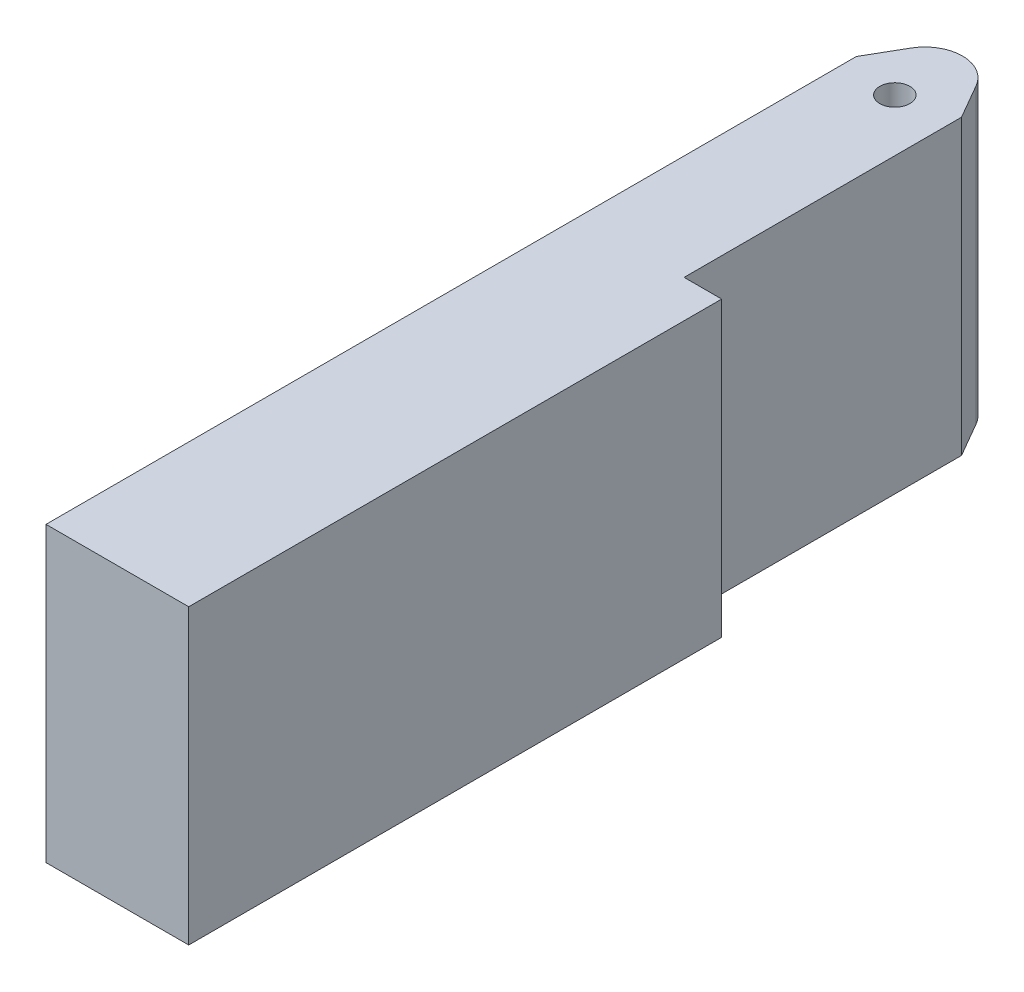
ISO-10303-21;
HEADER;
FILE_DESCRIPTION(('STEP AP214'),'2;1');
FILE_NAME('part.step','',(''),(''),'','','');
FILE_SCHEMA(('AUTOMOTIVE_DESIGN { 1 0 10303 214 1 1 1 1 }'));
ENDSEC;
DATA;
#1=APPLICATION_CONTEXT('core data for automotive mechanical design processes');
#2=APPLICATION_PROTOCOL_DEFINITION('international standard','automotive_design',2000,#1);
#3=PRODUCT_CONTEXT('',#1,'mechanical');
#4=PRODUCT('Part','Part','',(#3));
#5=PRODUCT_RELATED_PRODUCT_CATEGORY('part','',(#4));
#6=PRODUCT_DEFINITION_FORMATION('','',#4);
#7=PRODUCT_DEFINITION_CONTEXT('part definition',#1,'design');
#8=PRODUCT_DEFINITION('design','',#6,#7);
#9=PRODUCT_DEFINITION_SHAPE('','',#8);
#10=(LENGTH_UNIT() NAMED_UNIT(*) SI_UNIT(.MILLI.,.METRE.));
#11=(NAMED_UNIT(*) PLANE_ANGLE_UNIT() SI_UNIT($,.RADIAN.));
#12=(NAMED_UNIT(*) SI_UNIT($,.STERADIAN.) SOLID_ANGLE_UNIT());
#13=UNCERTAINTY_MEASURE_WITH_UNIT(LENGTH_MEASURE(1.E-05),#10,'distance_accuracy_value','');
#14=(GEOMETRIC_REPRESENTATION_CONTEXT(3) GLOBAL_UNCERTAINTY_ASSIGNED_CONTEXT((#13)) GLOBAL_UNIT_ASSIGNED_CONTEXT((#10,
#11,#12)) REPRESENTATION_CONTEXT('',''));
#15=CARTESIAN_POINT('',(0.,0.,0.));
#16=DIRECTION('',(0.,0.,1.));
#17=DIRECTION('',(1.,0.,0.));
#18=AXIS2_PLACEMENT_3D('',#15,#16,#17);
#19=CARTESIAN_POINT('',(0.,0.,-49.9999999999999));
#20=DIRECTION('',(0.,-1.,0.));
#21=DIRECTION('',(0.,0.,-1.));
#22=AXIS2_PLACEMENT_3D('',#19,#20,#21);
#23=CYLINDRICAL_SURFACE('',#22,5.);
#24=DIRECTION('',(0.,-1.,0.));
#25=VECTOR('',#24,1.);
#26=CARTESIAN_POINT('',(-4.33012701892221,0.,-52.4999999999999));
#27=LINE('',#26,#25);
#28=CARTESIAN_POINT('',(-4.33012701892221,39.,-52.4999999999999));
#29=VERTEX_POINT('',#28);
#30=CARTESIAN_POINT('',(-4.33012701892221,0.,-52.4999999999999));
#31=VERTEX_POINT('',#30);
#32=EDGE_CURVE('E156',#29,#31,#27,.T.);
#33=ORIENTED_EDGE('',*,*,#32,.F.);
#34=CARTESIAN_POINT('',(0.,39.,-49.9999999999999));
#35=DIRECTION('',(0.,1.,0.));
#36=DIRECTION('',(0.,0.,1.));
#37=AXIS2_PLACEMENT_3D('',#34,#35,#36);
#38=CIRCLE('',#37,5.);
#39=CARTESIAN_POINT('',(4.3301270189222,39.,-52.4999999999999));
#40=VERTEX_POINT('',#39);
#41=EDGE_CURVE('E41',#40,#29,#38,.T.);
#42=ORIENTED_EDGE('',*,*,#41,.F.);
#43=DIRECTION('',(0.,-1.,0.));
#44=VECTOR('',#43,1.);
#45=CARTESIAN_POINT('',(4.3301270189222,0.,-52.4999999999999));
#46=LINE('',#45,#44);
#47=CARTESIAN_POINT('',(4.3301270189222,0.,-52.4999999999999));
#48=VERTEX_POINT('',#47);
#49=EDGE_CURVE('E161',#48,#40,#46,.F.);
#50=ORIENTED_EDGE('',*,*,#49,.F.);
#51=CARTESIAN_POINT('',(0.,0.,-49.9999999999999));
#52=DIRECTION('',(0.,1.,0.));
#53=DIRECTION('',(0.,0.,1.));
#54=AXIS2_PLACEMENT_3D('',#51,#52,#53);
#55=CIRCLE('',#54,5.);
#56=EDGE_CURVE('E12',#31,#48,#55,.F.);
#57=ORIENTED_EDGE('',*,*,#56,.F.);
#58=EDGE_LOOP('',(#33,#42,#50,#57));
#59=FACE_BOUND('',#58,.T.);
#60=ADVANCED_FACE('F34',(#59),#23,.T.);
#61=CARTESIAN_POINT('',(0.,39.,0.));
#62=DIRECTION('',(0.,1.,0.));
#63=DIRECTION('',(0.,0.,1.));
#64=AXIS2_PLACEMENT_3D('',#61,#62,#63);
#65=PLANE('',#64);
#66=DIRECTION('',(1.,0.,0.));
#67=VECTOR('',#66,1.);
#68=CARTESIAN_POINT('',(7.,39.,-10.9474411167422));
#69=LINE('',#68,#67);
#70=CARTESIAN_POINT('',(7.,39.,-10.9474411167422));
#71=VERTEX_POINT('',#70);
#72=CARTESIAN_POINT('',(12.,39.,-10.9474411167422));
#73=VERTEX_POINT('',#72);
#74=EDGE_CURVE('E48',#71,#73,#69,.T.);
#75=ORIENTED_EDGE('',*,*,#74,.F.);
#76=DIRECTION('',(0.,0.,1.));
#77=VECTOR('',#76,1.);
#78=CARTESIAN_POINT('',(7.,39.,-36.9474411167422));
#79=LINE('',#78,#77);
#80=CARTESIAN_POINT('',(7.,39.,-47.8756443470177));
#81=VERTEX_POINT('',#80);
#82=EDGE_CURVE('E105',#81,#71,#79,.T.);
#83=ORIENTED_EDGE('',*,*,#82,.F.);
#84=DIRECTION('',(-0.499999999999997,0.,-0.866025403784441));
#85=VECTOR('',#84,1.);
#86=CARTESIAN_POINT('',(11.,39.,-40.9474411167422));
#87=LINE('',#86,#85);
#88=EDGE_CURVE('E143',#81,#40,#87,.T.);
#89=ORIENTED_EDGE('',*,*,#88,.T.);
#90=ORIENTED_EDGE('',*,*,#41,.T.);
#91=DIRECTION('',(-0.499999999999996,0.,0.866025403784441));
#92=VECTOR('',#91,1.);
#93=CARTESIAN_POINT('',(0.,39.,-60.));
#94=LINE('',#93,#92);
#95=CARTESIAN_POINT('',(-6.99999999999996,39.,-47.8756443470178));
#96=VERTEX_POINT('',#95);
#97=EDGE_CURVE('E146',#29,#96,#94,.T.);
#98=ORIENTED_EDGE('',*,*,#97,.T.);
#99=DIRECTION('',(0.,0.,-1.));
#100=VECTOR('',#99,1.);
#101=CARTESIAN_POINT('',(-7.00000000000001,39.,-36.9474411167422));
#102=LINE('',#101,#100);
#103=CARTESIAN_POINT('',(-7.00000000000001,39.,60.));
#104=VERTEX_POINT('',#103);
#105=EDGE_CURVE('E135',#104,#96,#102,.T.);
#106=ORIENTED_EDGE('',*,*,#105,.F.);
#107=DIRECTION('',(1.,0.,0.));
#108=VECTOR('',#107,1.);
#109=CARTESIAN_POINT('',(-11.,39.,60.));
#110=LINE('',#109,#108);
#111=CARTESIAN_POINT('',(12.,39.,60.));
#112=VERTEX_POINT('',#111);
#113=EDGE_CURVE('E153',#104,#112,#110,.T.);
#114=ORIENTED_EDGE('',*,*,#113,.T.);
#115=DIRECTION('',(0.,0.,1.));
#116=VECTOR('',#115,1.);
#117=CARTESIAN_POINT('',(12.,39.,60.));
#118=LINE('',#117,#116);
#119=EDGE_CURVE('E121',#73,#112,#118,.T.);
#120=ORIENTED_EDGE('',*,*,#119,.F.);
#121=EDGE_LOOP('',(#75,#83,#89,#90,#98,#106,#114,#120));
#122=FACE_BOUND('',#121,.T.);
#123=CARTESIAN_POINT('',(0.,39.,-45.9999999999999));
#124=DIRECTION('',(0.,1.,0.));
#125=DIRECTION('',(0.,0.,1.));
#126=AXIS2_PLACEMENT_3D('',#123,#124,#125);
#127=CIRCLE('',#126,2.);
#128=CARTESIAN_POINT('',(0.,39.,-43.9999999999999));
#129=VERTEX_POINT('',#128);
#130=EDGE_CURVE('E116',#129,#129,#127,.T.);
#131=ORIENTED_EDGE('',*,*,#130,.F.);
#132=EDGE_LOOP('',(#131));
#133=FACE_BOUND('',#132,.T.);
#134=ADVANCED_FACE('F166',(#122,#133),#65,.T.);
#135=CARTESIAN_POINT('',(0.,0.,0.));
#136=DIRECTION('',(0.,1.,0.));
#137=DIRECTION('',(0.,0.,1.));
#138=AXIS2_PLACEMENT_3D('',#135,#136,#137);
#139=PLANE('',#138);
#140=CARTESIAN_POINT('',(0.,0.,-45.9999999999999));
#141=DIRECTION('',(0.,1.,0.));
#142=DIRECTION('',(0.,0.,1.));
#143=AXIS2_PLACEMENT_3D('',#140,#141,#142);
#144=CIRCLE('',#143,2.);
#145=CARTESIAN_POINT('',(0.,0.,-43.9999999999999));
#146=VERTEX_POINT('',#145);
#147=EDGE_CURVE('E118',#146,#146,#144,.T.);
#148=ORIENTED_EDGE('',*,*,#147,.T.);
#149=EDGE_LOOP('',(#148));
#150=FACE_BOUND('',#149,.T.);
#151=DIRECTION('',(0.,0.,1.));
#152=VECTOR('',#151,1.);
#153=CARTESIAN_POINT('',(7.,0.,-36.9474411167422));
#154=LINE('',#153,#152);
#155=CARTESIAN_POINT('',(7.00000000000004,0.,-47.8756443470177));
#156=VERTEX_POINT('',#155);
#157=CARTESIAN_POINT('',(7.,0.,-10.9474411167422));
#158=VERTEX_POINT('',#157);
#159=EDGE_CURVE('E56',#156,#158,#154,.T.);
#160=ORIENTED_EDGE('',*,*,#159,.T.);
#161=DIRECTION('',(1.,0.,0.));
#162=VECTOR('',#161,1.);
#163=CARTESIAN_POINT('',(7.,0.,-10.9474411167422));
#164=LINE('',#163,#162);
#165=CARTESIAN_POINT('',(12.,0.,-10.9474411167422));
#166=VERTEX_POINT('',#165);
#167=EDGE_CURVE('E101',#158,#166,#164,.T.);
#168=ORIENTED_EDGE('',*,*,#167,.T.);
#169=DIRECTION('',(0.,0.,1.));
#170=VECTOR('',#169,1.);
#171=CARTESIAN_POINT('',(12.,0.,60.));
#172=LINE('',#171,#170);
#173=CARTESIAN_POINT('',(12.,0.,60.));
#174=VERTEX_POINT('',#173);
#175=EDGE_CURVE('E124',#166,#174,#172,.T.);
#176=ORIENTED_EDGE('',*,*,#175,.T.);
#177=DIRECTION('',(1.,0.,0.));
#178=VECTOR('',#177,1.);
#179=CARTESIAN_POINT('',(-11.,0.,60.));
#180=LINE('',#179,#178);
#181=CARTESIAN_POINT('',(-7.00000000000001,0.,60.));
#182=VERTEX_POINT('',#181);
#183=EDGE_CURVE('E149',#182,#174,#180,.T.);
#184=ORIENTED_EDGE('',*,*,#183,.F.);
#185=DIRECTION('',(0.,0.,-1.));
#186=VECTOR('',#185,1.);
#187=CARTESIAN_POINT('',(-7.00000000000001,0.,-36.9474411167422));
#188=LINE('',#187,#186);
#189=CARTESIAN_POINT('',(-7.00000000000001,0.,-47.8756443470178));
#190=VERTEX_POINT('',#189);
#191=EDGE_CURVE('E136',#182,#190,#188,.T.);
#192=ORIENTED_EDGE('',*,*,#191,.T.);
#193=DIRECTION('',(-0.499999999999996,0.,0.866025403784441));
#194=VECTOR('',#193,1.);
#195=CARTESIAN_POINT('',(0.,0.,-60.));
#196=LINE('',#195,#194);
#197=EDGE_CURVE('E145',#31,#190,#196,.T.);
#198=ORIENTED_EDGE('',*,*,#197,.F.);
#199=ORIENTED_EDGE('',*,*,#56,.T.);
#200=DIRECTION('',(-0.499999999999997,0.,-0.866025403784441));
#201=VECTOR('',#200,1.);
#202=CARTESIAN_POINT('',(11.,0.,-40.9474411167422));
#203=LINE('',#202,#201);
#204=EDGE_CURVE('E103',#156,#48,#203,.T.);
#205=ORIENTED_EDGE('',*,*,#204,.F.);
#206=EDGE_LOOP('',(#160,#168,#176,#184,#192,#198,#199,#205));
#207=FACE_BOUND('',#206,.T.);
#208=ADVANCED_FACE('F99',(#150,#207),#139,.F.);
#209=CARTESIAN_POINT('',(-11.,39.,60.));
#210=DIRECTION('',(0.,0.,-1.));
#211=DIRECTION('',(-1.,0.,0.));
#212=AXIS2_PLACEMENT_3D('',#209,#210,#211);
#213=PLANE('',#212);
#214=ORIENTED_EDGE('',*,*,#183,.T.);
#215=DIRECTION('',(0.,1.,0.));
#216=VECTOR('',#215,1.);
#217=CARTESIAN_POINT('',(12.,0.,60.));
#218=LINE('',#217,#216);
#219=EDGE_CURVE('E126',#174,#112,#218,.T.);
#220=ORIENTED_EDGE('',*,*,#219,.T.);
#221=ORIENTED_EDGE('',*,*,#113,.F.);
#222=DIRECTION('',(0.,1.,0.));
#223=VECTOR('',#222,1.);
#224=CARTESIAN_POINT('',(-7.00000000000001,0.,60.));
#225=LINE('',#224,#223);
#226=EDGE_CURVE('E130',#182,#104,#225,.T.);
#227=ORIENTED_EDGE('',*,*,#226,.F.);
#228=EDGE_LOOP('',(#214,#220,#221,#227));
#229=FACE_BOUND('',#228,.T.);
#230=ADVANCED_FACE('F181',(#229),#213,.F.);
#231=CARTESIAN_POINT('',(11.,0.,-40.9474411167422));
#232=DIRECTION('',(0.866025403784441,0.,-0.499999999999997));
#233=DIRECTION('',(-0.499999999999997,0.,-0.866025403784441));
#234=AXIS2_PLACEMENT_3D('',#231,#232,#233);
#235=PLANE('',#234);
#236=DIRECTION('',(0.,1.,0.));
#237=VECTOR('',#236,1.);
#238=CARTESIAN_POINT('',(7.,0.,-47.8756443470177));
#239=LINE('',#238,#237);
#240=EDGE_CURVE('E104',#156,#81,#239,.T.);
#241=ORIENTED_EDGE('',*,*,#240,.F.);
#242=ORIENTED_EDGE('',*,*,#204,.T.);
#243=ORIENTED_EDGE('',*,*,#49,.T.);
#244=ORIENTED_EDGE('',*,*,#88,.F.);
#245=EDGE_LOOP('',(#241,#242,#243,#244));
#246=FACE_BOUND('',#245,.T.);
#247=ADVANCED_FACE('F210',(#246),#235,.T.);
#248=CARTESIAN_POINT('',(0.,0.,-60.));
#249=DIRECTION('',(-0.866025403784441,0.,-0.499999999999996));
#250=DIRECTION('',(-0.499999999999996,0.,0.866025403784441));
#251=AXIS2_PLACEMENT_3D('',#248,#249,#250);
#252=PLANE('',#251);
#253=DIRECTION('',(0.,1.,0.));
#254=VECTOR('',#253,1.);
#255=CARTESIAN_POINT('',(-7.00000000000001,0.,-47.8756443470178));
#256=LINE('',#255,#254);
#257=EDGE_CURVE('E139',#190,#96,#256,.T.);
#258=ORIENTED_EDGE('',*,*,#257,.T.);
#259=ORIENTED_EDGE('',*,*,#97,.F.);
#260=ORIENTED_EDGE('',*,*,#32,.T.);
#261=ORIENTED_EDGE('',*,*,#197,.T.);
#262=EDGE_LOOP('',(#258,#259,#260,#261));
#263=FACE_BOUND('',#262,.T.);
#264=ADVANCED_FACE('F174',(#263),#252,.T.);
#265=CARTESIAN_POINT('',(-7.00000000000001,0.,-36.9474411167422));
#266=DIRECTION('',(1.,0.,0.));
#267=DIRECTION('',(0.,0.,-1.));
#268=AXIS2_PLACEMENT_3D('',#265,#266,#267);
#269=PLANE('',#268);
#270=ORIENTED_EDGE('',*,*,#105,.T.);
#271=ORIENTED_EDGE('',*,*,#257,.F.);
#272=ORIENTED_EDGE('',*,*,#191,.F.);
#273=ORIENTED_EDGE('',*,*,#226,.T.);
#274=EDGE_LOOP('',(#270,#271,#272,#273));
#275=FACE_BOUND('',#274,.T.);
#276=ADVANCED_FACE('F176',(#275),#269,.F.);
#277=CARTESIAN_POINT('',(7.,0.,-36.9474411167422));
#278=DIRECTION('',(-1.,0.,0.));
#279=DIRECTION('',(0.,0.,1.));
#280=AXIS2_PLACEMENT_3D('',#277,#278,#279);
#281=PLANE('',#280);
#282=ORIENTED_EDGE('',*,*,#82,.T.);
#283=DIRECTION('',(0.,1.,0.));
#284=VECTOR('',#283,1.);
#285=CARTESIAN_POINT('',(7.,0.,-10.9474411167422));
#286=LINE('',#285,#284);
#287=EDGE_CURVE('E107',#158,#71,#286,.T.);
#288=ORIENTED_EDGE('',*,*,#287,.F.);
#289=ORIENTED_EDGE('',*,*,#159,.F.);
#290=ORIENTED_EDGE('',*,*,#240,.T.);
#291=EDGE_LOOP('',(#282,#288,#289,#290));
#292=FACE_BOUND('',#291,.T.);
#293=ADVANCED_FACE('F108',(#292),#281,.F.);
#294=CARTESIAN_POINT('',(12.,0.,60.));
#295=DIRECTION('',(-1.,0.,0.));
#296=DIRECTION('',(0.,0.,1.));
#297=AXIS2_PLACEMENT_3D('',#294,#295,#296);
#298=PLANE('',#297);
#299=ORIENTED_EDGE('',*,*,#175,.F.);
#300=DIRECTION('',(0.,1.,0.));
#301=VECTOR('',#300,1.);
#302=CARTESIAN_POINT('',(12.,0.,-10.9474411167422));
#303=LINE('',#302,#301);
#304=EDGE_CURVE('E110',#166,#73,#303,.T.);
#305=ORIENTED_EDGE('',*,*,#304,.T.);
#306=ORIENTED_EDGE('',*,*,#119,.T.);
#307=ORIENTED_EDGE('',*,*,#219,.F.);
#308=EDGE_LOOP('',(#299,#305,#306,#307));
#309=FACE_BOUND('',#308,.T.);
#310=ADVANCED_FACE('F185',(#309),#298,.F.);
#311=CARTESIAN_POINT('',(0.,0.,-45.9999999999999));
#312=DIRECTION('',(0.,1.,0.));
#313=DIRECTION('',(0.,0.,1.));
#314=AXIS2_PLACEMENT_3D('',#311,#312,#313);
#315=CYLINDRICAL_SURFACE('',#314,2.);
#316=ORIENTED_EDGE('',*,*,#147,.F.);
#317=EDGE_LOOP('',(#316));
#318=FACE_BOUND('',#317,.T.);
#319=ORIENTED_EDGE('',*,*,#130,.T.);
#320=EDGE_LOOP('',(#319));
#321=FACE_BOUND('',#320,.T.);
#322=ADVANCED_FACE('F187',(#318,#321),#315,.F.);
#323=CARTESIAN_POINT('',(7.,0.,-10.9474411167422));
#324=DIRECTION('',(0.,0.,1.));
#325=DIRECTION('',(1.,0.,0.));
#326=AXIS2_PLACEMENT_3D('',#323,#324,#325);
#327=PLANE('',#326);
#328=ORIENTED_EDGE('',*,*,#74,.T.);
#329=ORIENTED_EDGE('',*,*,#304,.F.);
#330=ORIENTED_EDGE('',*,*,#167,.F.);
#331=ORIENTED_EDGE('',*,*,#287,.T.);
#332=EDGE_LOOP('',(#328,#329,#330,#331));
#333=FACE_BOUND('',#332,.T.);
#334=ADVANCED_FACE('F112',(#333),#327,.F.);
#335=CLOSED_SHELL('',(#60,#134,#208,#230,#247,#264,#276,#293,#310,#322,#334));
#336=MANIFOLD_SOLID_BREP('B2',#335);
#337=ADVANCED_BREP_SHAPE_REPRESENTATION('',(#18,#336),#14);
#338=SHAPE_DEFINITION_REPRESENTATION(#9,#337);
ENDSEC;
END-ISO-10303-21;
